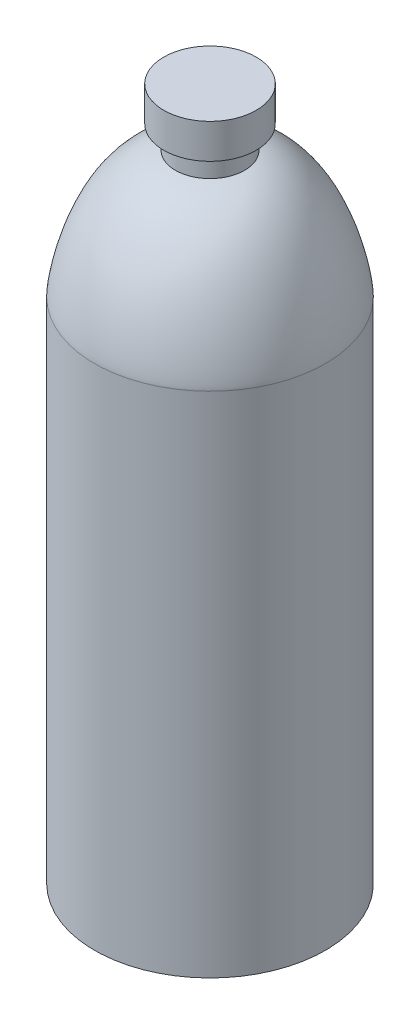
ISO-10303-21;
HEADER;
FILE_DESCRIPTION(('STEP AP214'),'2;1');
FILE_NAME('part.step','',(''),(''),'','','');
FILE_SCHEMA(('AUTOMOTIVE_DESIGN { 1 0 10303 214 1 1 1 1 }'));
ENDSEC;
DATA;
#1=APPLICATION_CONTEXT('core data for automotive mechanical design processes');
#2=APPLICATION_PROTOCOL_DEFINITION('international standard','automotive_design',2000,#1);
#3=PRODUCT_CONTEXT('',#1,'mechanical');
#4=PRODUCT('Part','Part','',(#3));
#5=PRODUCT_RELATED_PRODUCT_CATEGORY('part','',(#4));
#6=PRODUCT_DEFINITION_FORMATION('','',#4);
#7=PRODUCT_DEFINITION_CONTEXT('part definition',#1,'design');
#8=PRODUCT_DEFINITION('design','',#6,#7);
#9=PRODUCT_DEFINITION_SHAPE('','',#8);
#10=(LENGTH_UNIT() NAMED_UNIT(*) SI_UNIT(.MILLI.,.METRE.));
#11=(NAMED_UNIT(*) PLANE_ANGLE_UNIT() SI_UNIT($,.RADIAN.));
#12=(NAMED_UNIT(*) SI_UNIT($,.STERADIAN.) SOLID_ANGLE_UNIT());
#13=UNCERTAINTY_MEASURE_WITH_UNIT(LENGTH_MEASURE(1.E-05),#10,'distance_accuracy_value','');
#14=(GEOMETRIC_REPRESENTATION_CONTEXT(3) GLOBAL_UNCERTAINTY_ASSIGNED_CONTEXT((#13)) GLOBAL_UNIT_ASSIGNED_CONTEXT((#10,
#11,#12)) REPRESENTATION_CONTEXT('',''));
#15=CARTESIAN_POINT('',(0.,0.,0.));
#16=DIRECTION('',(0.,0.,1.));
#17=DIRECTION('',(1.,0.,0.));
#18=AXIS2_PLACEMENT_3D('',#15,#16,#17);
#19=CARTESIAN_POINT('',(0.,-95.25,-31.75));
#20=DIRECTION('',(0.,-1.,0.));
#21=DIRECTION('',(0.,0.,-1.));
#22=AXIS2_PLACEMENT_3D('',#19,#20,#21);
#23=PLANE('',#22);
#24=CARTESIAN_POINT('',(0.,-95.25,0.));
#25=DIRECTION('',(0.,-1.,0.));
#26=DIRECTION('',(0.,0.,-1.));
#27=AXIS2_PLACEMENT_3D('',#24,#25,#26);
#28=CIRCLE('',#27,31.75);
#29=CARTESIAN_POINT('',(0.,-95.25,-31.75));
#30=VERTEX_POINT('',#29);
#31=EDGE_CURVE('E10',#30,#30,#28,.T.);
#32=ORIENTED_EDGE('',*,*,#31,.T.);
#33=EDGE_LOOP('',(#32));
#34=FACE_BOUND('',#33,.T.);
#35=ADVANCED_FACE('F31',(#34),#23,.T.);
#36=CARTESIAN_POINT('',(0.,-95.25,0.));
#37=DIRECTION('',(0.,-1.,0.));
#38=DIRECTION('',(0.,0.,-1.));
#39=AXIS2_PLACEMENT_3D('',#36,#37,#38);
#40=CYLINDRICAL_SURFACE('',#39,31.75);
#41=CARTESIAN_POINT('',(0.,44.45,0.));
#42=DIRECTION('',(0.,-1.,0.));
#43=DIRECTION('',(0.,0.,-1.));
#44=AXIS2_PLACEMENT_3D('',#41,#42,#43);
#45=CIRCLE('',#44,31.75);
#46=CARTESIAN_POINT('',(0.,44.45,-31.75));
#47=VERTEX_POINT('',#46);
#48=EDGE_CURVE('E37',#47,#47,#45,.T.);
#49=ORIENTED_EDGE('',*,*,#48,.T.);
#50=EDGE_LOOP('',(#49));
#51=FACE_BOUND('',#50,.T.);
#52=ORIENTED_EDGE('',*,*,#31,.F.);
#53=EDGE_LOOP('',(#52));
#54=FACE_BOUND('',#53,.T.);
#55=ADVANCED_FACE('F67',(#51,#54),#40,.T.);
#56=CARTESIAN_POINT('',(0.,44.45,-31.75));
#57=CARTESIAN_POINT('',(0.,46.8647968555016,-31.9000021232838));
#58=CARTESIAN_POINT('',(0.,75.4747744623813,-27.5232639224272));
#59=CARTESIAN_POINT('',(0.,79.375,-9.525));
#60=B_SPLINE_CURVE_WITH_KNOTS('',3,(#56,#57,#58,#59),.UNSPECIFIED.,.F.,.F.,(4,4),(0.,1.),.UNSPECIFIED.);
#61=CARTESIAN_POINT('',(0.,-95.25,0.));
#62=DIRECTION('',(0.,-1.,0.));
#63=AXIS1_PLACEMENT('',#61,#62);
#64=SURFACE_OF_REVOLUTION('',#60,#63);
#65=CARTESIAN_POINT('',(0.,79.375,0.));
#66=DIRECTION('',(0.,-1.,0.));
#67=DIRECTION('',(0.,0.,-1.));
#68=AXIS2_PLACEMENT_3D('',#65,#66,#67);
#69=CIRCLE('',#68,9.525);
#70=CARTESIAN_POINT('',(0.,79.375,-9.525));
#71=VERTEX_POINT('',#70);
#72=EDGE_CURVE('E41',#71,#71,#69,.T.);
#73=ORIENTED_EDGE('',*,*,#72,.T.);
#74=EDGE_LOOP('',(#73));
#75=FACE_BOUND('',#74,.T.);
#76=ORIENTED_EDGE('',*,*,#48,.F.);
#77=EDGE_LOOP('',(#76));
#78=FACE_BOUND('',#77,.T.);
#79=ADVANCED_FACE('F63',(#75,#78),#64,.F.);
#80=CARTESIAN_POINT('',(0.,-95.25,0.));
#81=DIRECTION('',(0.,-1.,0.));
#82=DIRECTION('',(0.,0.,-1.));
#83=AXIS2_PLACEMENT_3D('',#80,#81,#82);
#84=CYLINDRICAL_SURFACE('',#83,9.525);
#85=CARTESIAN_POINT('',(0.,85.725,0.));
#86=DIRECTION('',(0.,-1.,0.));
#87=DIRECTION('',(0.,0.,-1.));
#88=AXIS2_PLACEMENT_3D('',#85,#86,#87);
#89=CIRCLE('',#88,9.525);
#90=CARTESIAN_POINT('',(0.,85.725,-9.525));
#91=VERTEX_POINT('',#90);
#92=EDGE_CURVE('E45',#91,#91,#89,.T.);
#93=ORIENTED_EDGE('',*,*,#92,.T.);
#94=EDGE_LOOP('',(#93));
#95=FACE_BOUND('',#94,.T.);
#96=ORIENTED_EDGE('',*,*,#72,.F.);
#97=EDGE_LOOP('',(#96));
#98=FACE_BOUND('',#97,.T.);
#99=ADVANCED_FACE('F66',(#95,#98),#84,.T.);
#100=CARTESIAN_POINT('',(0.,85.725,-12.7));
#101=DIRECTION('',(0.,-1.,0.));
#102=DIRECTION('',(0.,0.,-1.));
#103=AXIS2_PLACEMENT_3D('',#100,#101,#102);
#104=PLANE('',#103);
#105=CARTESIAN_POINT('',(0.,85.725,0.));
#106=DIRECTION('',(0.,-1.,0.));
#107=DIRECTION('',(0.,0.,-1.));
#108=AXIS2_PLACEMENT_3D('',#105,#106,#107);
#109=CIRCLE('',#108,12.7);
#110=CARTESIAN_POINT('',(0.,85.725,-12.7));
#111=VERTEX_POINT('',#110);
#112=EDGE_CURVE('E50',#111,#111,#109,.T.);
#113=ORIENTED_EDGE('',*,*,#112,.T.);
#114=EDGE_LOOP('',(#113));
#115=FACE_BOUND('',#114,.T.);
#116=ORIENTED_EDGE('',*,*,#92,.F.);
#117=EDGE_LOOP('',(#116));
#118=FACE_BOUND('',#117,.T.);
#119=ADVANCED_FACE('F96',(#115,#118),#104,.T.);
#120=CARTESIAN_POINT('',(0.,-95.25,0.));
#121=DIRECTION('',(0.,-1.,0.));
#122=DIRECTION('',(0.,0.,-1.));
#123=AXIS2_PLACEMENT_3D('',#120,#121,#122);
#124=CYLINDRICAL_SURFACE('',#123,12.7);
#125=CARTESIAN_POINT('',(0.,95.25,0.));
#126=DIRECTION('',(0.,-1.,0.));
#127=DIRECTION('',(0.,0.,-1.));
#128=AXIS2_PLACEMENT_3D('',#125,#126,#127);
#129=CIRCLE('',#128,12.7);
#130=CARTESIAN_POINT('',(0.,95.25,-12.7));
#131=VERTEX_POINT('',#130);
#132=EDGE_CURVE('E53',#131,#131,#129,.T.);
#133=ORIENTED_EDGE('',*,*,#132,.T.);
#134=EDGE_LOOP('',(#133));
#135=FACE_BOUND('',#134,.T.);
#136=ORIENTED_EDGE('',*,*,#112,.F.);
#137=EDGE_LOOP('',(#136));
#138=FACE_BOUND('',#137,.T.);
#139=ADVANCED_FACE('F105',(#135,#138),#124,.T.);
#140=CARTESIAN_POINT('',(0.,95.25,0.));
#141=DIRECTION('',(0.,1.,0.));
#142=DIRECTION('',(0.,0.,1.));
#143=AXIS2_PLACEMENT_3D('',#140,#141,#142);
#144=PLANE('',#143);
#145=ORIENTED_EDGE('',*,*,#132,.F.);
#146=EDGE_LOOP('',(#145));
#147=FACE_BOUND('',#146,.T.);
#148=ADVANCED_FACE('F114',(#147),#144,.T.);
#149=CLOSED_SHELL('',(#35,#55,#79,#99,#119,#139,#148));
#150=MANIFOLD_SOLID_BREP('B2',#149);
#151=ADVANCED_BREP_SHAPE_REPRESENTATION('',(#18,#150),#14);
#152=SHAPE_DEFINITION_REPRESENTATION(#9,#151);
ENDSEC;
END-ISO-10303-21;
